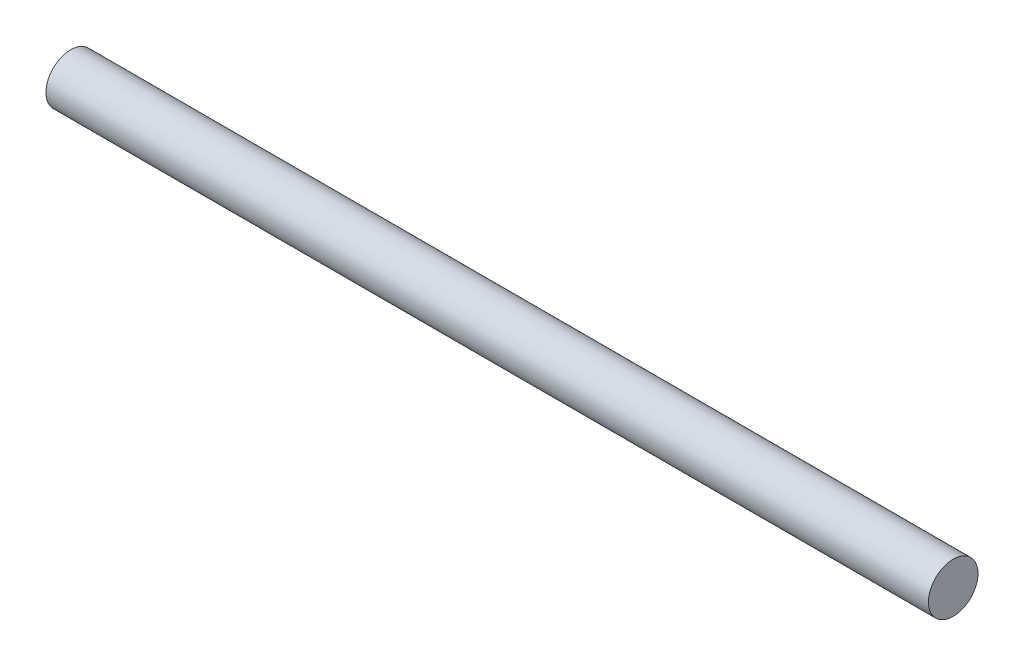
ISO-10303-21;
HEADER;
FILE_DESCRIPTION(('STEP AP214'),'2;1');
FILE_NAME('part.step','',(''),(''),'','','');
FILE_SCHEMA(('AUTOMOTIVE_DESIGN { 1 0 10303 214 1 1 1 1 }'));
ENDSEC;
DATA;
#1=APPLICATION_CONTEXT('core data for automotive mechanical design processes');
#2=APPLICATION_PROTOCOL_DEFINITION('international standard','automotive_design',2000,#1);
#3=PRODUCT_CONTEXT('',#1,'mechanical');
#4=PRODUCT('Part','Part','',(#3));
#5=PRODUCT_RELATED_PRODUCT_CATEGORY('part','',(#4));
#6=PRODUCT_DEFINITION_FORMATION('','',#4);
#7=PRODUCT_DEFINITION_CONTEXT('part definition',#1,'design');
#8=PRODUCT_DEFINITION('design','',#6,#7);
#9=PRODUCT_DEFINITION_SHAPE('','',#8);
#10=(LENGTH_UNIT() NAMED_UNIT(*) SI_UNIT(.MILLI.,.METRE.));
#11=(NAMED_UNIT(*) PLANE_ANGLE_UNIT() SI_UNIT($,.RADIAN.));
#12=(NAMED_UNIT(*) SI_UNIT($,.STERADIAN.) SOLID_ANGLE_UNIT());
#13=UNCERTAINTY_MEASURE_WITH_UNIT(LENGTH_MEASURE(1.E-05),#10,'distance_accuracy_value','');
#14=(GEOMETRIC_REPRESENTATION_CONTEXT(3) GLOBAL_UNCERTAINTY_ASSIGNED_CONTEXT((#13)) GLOBAL_UNIT_ASSIGNED_CONTEXT((#10,
#11,#12)) REPRESENTATION_CONTEXT('',''));
#15=CARTESIAN_POINT('',(0.,0.,0.));
#16=DIRECTION('',(0.,0.,1.));
#17=DIRECTION('',(1.,0.,0.));
#18=AXIS2_PLACEMENT_3D('',#15,#16,#17);
#19=CARTESIAN_POINT('',(-140.,7.49999999999996,0.));
#20=DIRECTION('',(-1.,0.,0.));
#21=DIRECTION('',(0.,0.,1.));
#22=AXIS2_PLACEMENT_3D('',#19,#20,#21);
#23=PLANE('',#22);
#24=CARTESIAN_POINT('',(-140.,0.,0.));
#25=DIRECTION('',(1.,0.,0.));
#26=DIRECTION('',(0.,0.,-1.));
#27=AXIS2_PLACEMENT_3D('',#24,#25,#26);
#28=CIRCLE('',#27,5.49999999999997);
#29=CARTESIAN_POINT('',(-140.,0.,-5.49999999999997));
#30=VERTEX_POINT('',#29);
#31=EDGE_CURVE('E10',#30,#30,#28,.T.);
#32=ORIENTED_EDGE('',*,*,#31,.T.);
#33=EDGE_LOOP('',(#32));
#34=FACE_BOUND('',#33,.T.);
#35=CARTESIAN_POINT('',(-140.,0.,0.));
#36=DIRECTION('',(1.,0.,0.));
#37=DIRECTION('',(0.,0.,-1.));
#38=AXIS2_PLACEMENT_3D('',#35,#36,#37);
#39=CIRCLE('',#38,7.49999999999997);
#40=CARTESIAN_POINT('',(-140.,0.,-7.49999999999997));
#41=VERTEX_POINT('',#40);
#42=EDGE_CURVE('E45',#41,#41,#39,.T.);
#43=ORIENTED_EDGE('',*,*,#42,.F.);
#44=EDGE_LOOP('',(#43));
#45=FACE_BOUND('',#44,.T.);
#46=ADVANCED_FACE('F31',(#34,#45),#23,.T.);
#47=CARTESIAN_POINT('',(196.356223273704,0.,0.));
#48=DIRECTION('',(1.,0.,0.));
#49=DIRECTION('',(0.,0.,-1.));
#50=AXIS2_PLACEMENT_3D('',#47,#48,#49);
#51=CYLINDRICAL_SURFACE('',#50,5.49999999999997);
#52=CARTESIAN_POINT('',(-127.,0.,0.));
#53=DIRECTION('',(1.,0.,0.));
#54=DIRECTION('',(0.,0.,-1.));
#55=AXIS2_PLACEMENT_3D('',#52,#53,#54);
#56=CIRCLE('',#55,5.49999999999997);
#57=CARTESIAN_POINT('',(-127.,0.,-5.49999999999997));
#58=VERTEX_POINT('',#57);
#59=EDGE_CURVE('E37',#58,#58,#56,.T.);
#60=ORIENTED_EDGE('',*,*,#59,.T.);
#61=EDGE_LOOP('',(#60));
#62=FACE_BOUND('',#61,.T.);
#63=ORIENTED_EDGE('',*,*,#31,.F.);
#64=EDGE_LOOP('',(#63));
#65=FACE_BOUND('',#64,.T.);
#66=ADVANCED_FACE('F55',(#62,#65),#51,.F.);
#67=CARTESIAN_POINT('',(-127.,5.49999999999996,0.));
#68=DIRECTION('',(-1.,0.,0.));
#69=DIRECTION('',(0.,0.,1.));
#70=AXIS2_PLACEMENT_3D('',#67,#68,#69);
#71=PLANE('',#70);
#72=ORIENTED_EDGE('',*,*,#59,.F.);
#73=EDGE_LOOP('',(#72));
#74=FACE_BOUND('',#73,.T.);
#75=ADVANCED_FACE('F59',(#74),#71,.T.);
#76=CARTESIAN_POINT('',(127.,7.49999999999999,0.));
#77=DIRECTION('',(1.,0.,0.));
#78=DIRECTION('',(0.,0.,-1.));
#79=AXIS2_PLACEMENT_3D('',#76,#77,#78);
#80=PLANE('',#79);
#81=CARTESIAN_POINT('',(127.,0.,0.));
#82=DIRECTION('',(1.,0.,0.));
#83=DIRECTION('',(0.,0.,-1.));
#84=AXIS2_PLACEMENT_3D('',#81,#82,#83);
#85=CIRCLE('',#84,7.50000000000001);
#86=CARTESIAN_POINT('',(127.,0.,-7.50000000000001));
#87=VERTEX_POINT('',#86);
#88=EDGE_CURVE('E41',#87,#87,#85,.T.);
#89=ORIENTED_EDGE('',*,*,#88,.T.);
#90=EDGE_LOOP('',(#89));
#91=FACE_BOUND('',#90,.T.);
#92=ADVANCED_FACE('F63',(#91),#80,.T.);
#93=CARTESIAN_POINT('',(196.356223273704,0.,0.));
#94=DIRECTION('',(1.,0.,0.));
#95=DIRECTION('',(0.,0.,-1.));
#96=AXIS2_PLACEMENT_3D('',#93,#94,#95);
#97=CYLINDRICAL_SURFACE('',#96,7.49999999999999);
#98=ORIENTED_EDGE('',*,*,#42,.T.);
#99=EDGE_LOOP('',(#98));
#100=FACE_BOUND('',#99,.T.);
#101=ORIENTED_EDGE('',*,*,#88,.F.);
#102=EDGE_LOOP('',(#101));
#103=FACE_BOUND('',#102,.T.);
#104=ADVANCED_FACE('F51',(#100,#103),#97,.T.);
#105=CLOSED_SHELL('',(#46,#66,#75,#92,#104));
#106=MANIFOLD_SOLID_BREP('B2',#105);
#107=ADVANCED_BREP_SHAPE_REPRESENTATION('',(#18,#106),#14);
#108=SHAPE_DEFINITION_REPRESENTATION(#9,#107);
ENDSEC;
END-ISO-10303-21;
